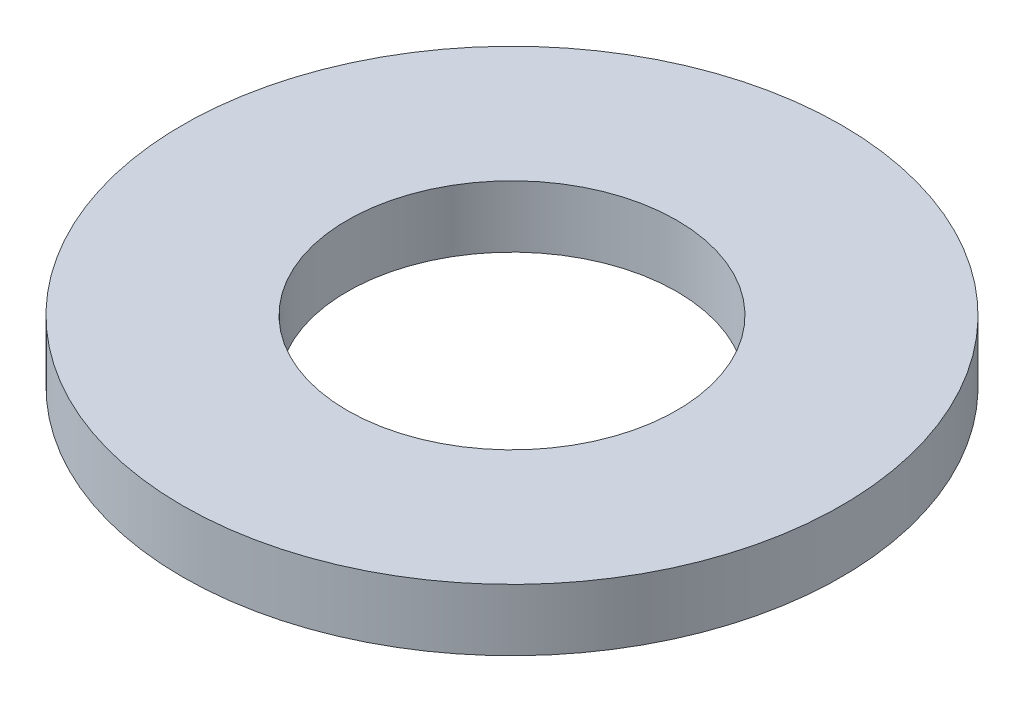
ISO-10303-21;
HEADER;
FILE_DESCRIPTION(('STEP AP214'),'2;1');
FILE_NAME('part.step','',(''),(''),'','','');
FILE_SCHEMA(('AUTOMOTIVE_DESIGN { 1 0 10303 214 1 1 1 1 }'));
ENDSEC;
DATA;
#1=APPLICATION_CONTEXT('core data for automotive mechanical design processes');
#2=APPLICATION_PROTOCOL_DEFINITION('international standard','automotive_design',2000,#1);
#3=PRODUCT_CONTEXT('',#1,'mechanical');
#4=PRODUCT('Part','Part','',(#3));
#5=PRODUCT_RELATED_PRODUCT_CATEGORY('part','',(#4));
#6=PRODUCT_DEFINITION_FORMATION('','',#4);
#7=PRODUCT_DEFINITION_CONTEXT('part definition',#1,'design');
#8=PRODUCT_DEFINITION('design','',#6,#7);
#9=PRODUCT_DEFINITION_SHAPE('','',#8);
#10=(LENGTH_UNIT() NAMED_UNIT(*) SI_UNIT(.MILLI.,.METRE.));
#11=(NAMED_UNIT(*) PLANE_ANGLE_UNIT() SI_UNIT($,.RADIAN.));
#12=(NAMED_UNIT(*) SI_UNIT($,.STERADIAN.) SOLID_ANGLE_UNIT());
#13=UNCERTAINTY_MEASURE_WITH_UNIT(LENGTH_MEASURE(1.E-05),#10,'distance_accuracy_value','');
#14=(GEOMETRIC_REPRESENTATION_CONTEXT(3) GLOBAL_UNCERTAINTY_ASSIGNED_CONTEXT((#13)) GLOBAL_UNIT_ASSIGNED_CONTEXT((#10,
#11,#12)) REPRESENTATION_CONTEXT('',''));
#15=CARTESIAN_POINT('',(0.,0.,0.));
#16=DIRECTION('',(0.,0.,1.));
#17=DIRECTION('',(1.,0.,0.));
#18=AXIS2_PLACEMENT_3D('',#15,#16,#17);
#19=CARTESIAN_POINT('',(0.,1.5,0.));
#20=DIRECTION('',(0.,1.,0.));
#21=DIRECTION('',(0.,0.,1.));
#22=AXIS2_PLACEMENT_3D('',#19,#20,#21);
#23=PLANE('',#22);
#24=CARTESIAN_POINT('',(0.,1.5,0.));
#25=DIRECTION('',(0.,1.,0.));
#26=DIRECTION('',(0.,0.,1.));
#27=AXIS2_PLACEMENT_3D('',#24,#25,#26);
#28=CIRCLE('',#27,16.);
#29=CARTESIAN_POINT('',(0.,1.5,16.));
#30=VERTEX_POINT('',#29);
#31=EDGE_CURVE('E10',#30,#30,#28,.T.);
#32=ORIENTED_EDGE('',*,*,#31,.T.);
#33=EDGE_LOOP('',(#32));
#34=FACE_BOUND('',#33,.T.);
#35=CARTESIAN_POINT('',(0.,1.5,0.));
#36=DIRECTION('',(0.,1.,0.));
#37=DIRECTION('',(0.,0.,1.));
#38=AXIS2_PLACEMENT_3D('',#35,#36,#37);
#39=CIRCLE('',#38,8.);
#40=CARTESIAN_POINT('',(0.,1.5,8.));
#41=VERTEX_POINT('',#40);
#42=EDGE_CURVE('E54',#41,#41,#39,.T.);
#43=ORIENTED_EDGE('',*,*,#42,.F.);
#44=EDGE_LOOP('',(#43));
#45=FACE_BOUND('',#44,.T.);
#46=ADVANCED_FACE('F41',(#34,#45),#23,.T.);
#47=CARTESIAN_POINT('',(0.,-1.5,0.));
#48=DIRECTION('',(0.,1.,0.));
#49=DIRECTION('',(0.,0.,1.));
#50=AXIS2_PLACEMENT_3D('',#47,#48,#49);
#51=PLANE('',#50);
#52=CARTESIAN_POINT('',(0.,-1.5,0.));
#53=DIRECTION('',(0.,1.,0.));
#54=DIRECTION('',(0.,0.,1.));
#55=AXIS2_PLACEMENT_3D('',#52,#53,#54);
#56=CIRCLE('',#55,16.);
#57=CARTESIAN_POINT('',(0.,-1.5,16.));
#58=VERTEX_POINT('',#57);
#59=EDGE_CURVE('E45',#58,#58,#56,.T.);
#60=ORIENTED_EDGE('',*,*,#59,.F.);
#61=EDGE_LOOP('',(#60));
#62=FACE_BOUND('',#61,.T.);
#63=CARTESIAN_POINT('',(0.,-1.5,0.));
#64=DIRECTION('',(0.,1.,0.));
#65=DIRECTION('',(0.,0.,1.));
#66=AXIS2_PLACEMENT_3D('',#63,#64,#65);
#67=CIRCLE('',#66,8.);
#68=CARTESIAN_POINT('',(0.,-1.5,8.));
#69=VERTEX_POINT('',#68);
#70=EDGE_CURVE('E56',#69,#69,#67,.T.);
#71=ORIENTED_EDGE('',*,*,#70,.T.);
#72=EDGE_LOOP('',(#71));
#73=FACE_BOUND('',#72,.T.);
#74=ADVANCED_FACE('F68',(#62,#73),#51,.F.);
#75=CARTESIAN_POINT('',(0.,1.5,0.));
#76=DIRECTION('',(0.,-1.,0.));
#77=DIRECTION('',(0.,0.,-1.));
#78=AXIS2_PLACEMENT_3D('',#75,#76,#77);
#79=CYLINDRICAL_SURFACE('',#78,16.);
#80=ORIENTED_EDGE('',*,*,#31,.F.);
#81=EDGE_LOOP('',(#80));
#82=FACE_BOUND('',#81,.T.);
#83=ORIENTED_EDGE('',*,*,#59,.T.);
#84=EDGE_LOOP('',(#83));
#85=FACE_BOUND('',#84,.T.);
#86=ADVANCED_FACE('F43',(#82,#85),#79,.T.);
#87=CARTESIAN_POINT('',(0.,1.5,0.));
#88=DIRECTION('',(0.,-1.,0.));
#89=DIRECTION('',(0.,0.,-1.));
#90=AXIS2_PLACEMENT_3D('',#87,#88,#89);
#91=CYLINDRICAL_SURFACE('',#90,8.);
#92=ORIENTED_EDGE('',*,*,#42,.T.);
#93=EDGE_LOOP('',(#92));
#94=FACE_BOUND('',#93,.T.);
#95=ORIENTED_EDGE('',*,*,#70,.F.);
#96=EDGE_LOOP('',(#95));
#97=FACE_BOUND('',#96,.T.);
#98=ADVANCED_FACE('F64',(#94,#97),#91,.F.);
#99=CLOSED_SHELL('',(#46,#74,#86,#98));
#100=MANIFOLD_SOLID_BREP('B2',#99);
#101=ADVANCED_BREP_SHAPE_REPRESENTATION('',(#18,#100),#14);
#102=SHAPE_DEFINITION_REPRESENTATION(#9,#101);
ENDSEC;
END-ISO-10303-21;
